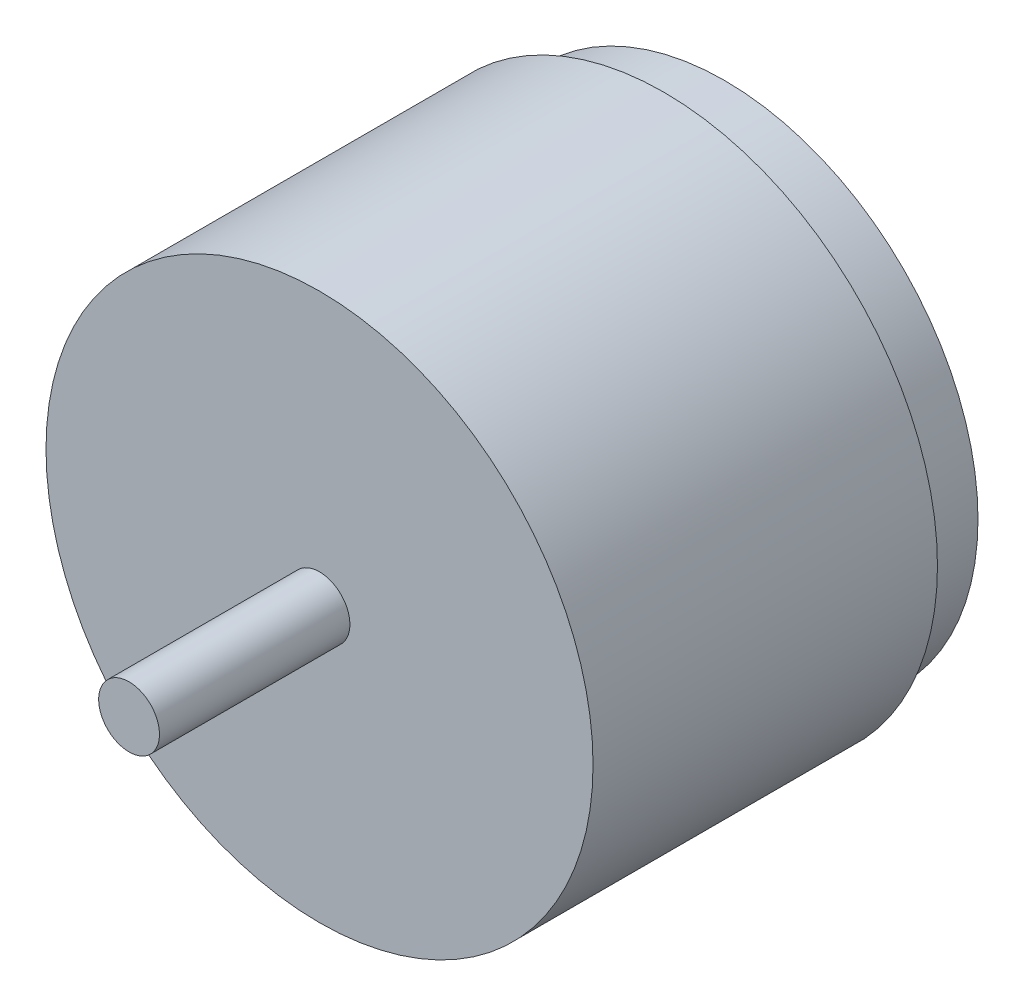
ISO-10303-21;
HEADER;
FILE_DESCRIPTION(('STEP AP214'),'2;1');
FILE_NAME('part.step','',(''),(''),'','','');
FILE_SCHEMA(('AUTOMOTIVE_DESIGN { 1 0 10303 214 1 1 1 1 }'));
ENDSEC;
DATA;
#1=APPLICATION_CONTEXT('core data for automotive mechanical design processes');
#2=APPLICATION_PROTOCOL_DEFINITION('international standard','automotive_design',2000,#1);
#3=PRODUCT_CONTEXT('',#1,'mechanical');
#4=PRODUCT('Part','Part','',(#3));
#5=PRODUCT_RELATED_PRODUCT_CATEGORY('part','',(#4));
#6=PRODUCT_DEFINITION_FORMATION('','',#4);
#7=PRODUCT_DEFINITION_CONTEXT('part definition',#1,'design');
#8=PRODUCT_DEFINITION('design','',#6,#7);
#9=PRODUCT_DEFINITION_SHAPE('','',#8);
#10=(LENGTH_UNIT() NAMED_UNIT(*) SI_UNIT(.MILLI.,.METRE.));
#11=(NAMED_UNIT(*) PLANE_ANGLE_UNIT() SI_UNIT($,.RADIAN.));
#12=(NAMED_UNIT(*) SI_UNIT($,.STERADIAN.) SOLID_ANGLE_UNIT());
#13=UNCERTAINTY_MEASURE_WITH_UNIT(LENGTH_MEASURE(1.E-05),#10,'distance_accuracy_value','');
#14=(GEOMETRIC_REPRESENTATION_CONTEXT(3) GLOBAL_UNCERTAINTY_ASSIGNED_CONTEXT((#13)) GLOBAL_UNIT_ASSIGNED_CONTEXT((#10,
#11,#12)) REPRESENTATION_CONTEXT('',''));
#15=CARTESIAN_POINT('',(0.,0.,0.));
#16=DIRECTION('',(0.,0.,1.));
#17=DIRECTION('',(1.,0.,0.));
#18=AXIS2_PLACEMENT_3D('',#15,#16,#17);
#19=CARTESIAN_POINT('',(42.638538905549,42.638538905549,14.7));
#20=DIRECTION('',(0.,0.,1.));
#21=DIRECTION('',(1.,0.,0.));
#22=AXIS2_PLACEMENT_3D('',#19,#20,#21);
#23=PLANE('',#22);
#24=CARTESIAN_POINT('',(42.638538905549,42.638538905549,14.7));
#25=DIRECTION('',(0.,0.,1.));
#26=DIRECTION('',(1.,0.,0.));
#27=AXIS2_PLACEMENT_3D('',#24,#25,#26);
#28=CIRCLE('',#27,0.75);
#29=CARTESIAN_POINT('',(43.388538905549,42.638538905549,14.7));
#30=VERTEX_POINT('',#29);
#31=EDGE_CURVE('E9',#30,#30,#28,.T.);
#32=ORIENTED_EDGE('',*,*,#31,.T.);
#33=EDGE_LOOP('',(#32));
#34=FACE_BOUND('',#33,.T.);
#35=ADVANCED_FACE('F15',(#34),#23,.T.);
#36=CARTESIAN_POINT('',(42.638538905549,42.638538905549,0.));
#37=DIRECTION('',(0.,0.,1.));
#38=DIRECTION('',(1.,0.,0.));
#39=AXIS2_PLACEMENT_3D('',#36,#37,#38);
#40=PLANE('',#39);
#41=CARTESIAN_POINT('',(42.638538905549,42.638538905549,0.));
#42=DIRECTION('',(0.,0.,1.));
#43=DIRECTION('',(1.,0.,0.));
#44=AXIS2_PLACEMENT_3D('',#41,#42,#43);
#45=CIRCLE('',#44,6.25);
#46=CARTESIAN_POINT('',(48.888538905549,42.638538905549,0.));
#47=VERTEX_POINT('',#46);
#48=EDGE_CURVE('E81',#47,#47,#45,.T.);
#49=ORIENTED_EDGE('',*,*,#48,.F.);
#50=EDGE_LOOP('',(#49));
#51=FACE_BOUND('',#50,.T.);
#52=ADVANCED_FACE('F110',(#51),#40,.F.);
#53=CARTESIAN_POINT('',(42.638538905549,42.638538905549,10.));
#54=DIRECTION('',(0.,0.,-1.));
#55=DIRECTION('',(1.,0.,0.));
#56=AXIS2_PLACEMENT_3D('',#53,#54,#55);
#57=CYLINDRICAL_SURFACE('',#56,0.75);
#58=CARTESIAN_POINT('',(42.638538905549,42.638538905549,10.));
#59=DIRECTION('',(0.,0.,1.));
#60=DIRECTION('',(1.,0.,0.));
#61=AXIS2_PLACEMENT_3D('',#58,#59,#60);
#62=CIRCLE('',#61,0.75);
#63=CARTESIAN_POINT('',(43.388538905549,42.638538905549,10.));
#64=VERTEX_POINT('',#63);
#65=EDGE_CURVE('E82',#64,#64,#62,.T.);
#66=ORIENTED_EDGE('',*,*,#65,.T.);
#67=DIRECTION('',(0.,0.,1.));
#68=VECTOR('',#67,1.);
#69=CARTESIAN_POINT('',(43.388538905549,42.638538905549,10.));
#70=LINE('',#69,#68);
#71=EDGE_CURVE('E23',#64,#30,#70,.T.);
#72=ORIENTED_EDGE('',*,*,#71,.T.);
#73=ORIENTED_EDGE('',*,*,#31,.F.);
#74=ORIENTED_EDGE('',*,*,#71,.F.);
#75=EDGE_LOOP('',(#66,#72,#73,#74));
#76=FACE_BOUND('',#75,.T.);
#77=ADVANCED_FACE('F112',(#76),#57,.T.);
#78=CARTESIAN_POINT('',(42.638538905549,42.638538905549,0.));
#79=DIRECTION('',(0.,0.,-1.));
#80=DIRECTION('',(1.,0.,0.));
#81=AXIS2_PLACEMENT_3D('',#78,#79,#80);
#82=CYLINDRICAL_SURFACE('',#81,6.25);
#83=ORIENTED_EDGE('',*,*,#48,.T.);
#84=DIRECTION('',(0.,0.,1.));
#85=VECTOR('',#84,1.);
#86=CARTESIAN_POINT('',(48.888538905549,42.638538905549,0.));
#87=LINE('',#86,#85);
#88=CARTESIAN_POINT('',(48.888538905549,42.638538905549,1.5));
#89=VERTEX_POINT('',#88);
#90=EDGE_CURVE('E37',#47,#89,#87,.T.);
#91=ORIENTED_EDGE('',*,*,#90,.T.);
#92=CARTESIAN_POINT('',(42.638538905549,42.638538905549,1.5));
#93=DIRECTION('',(0.,0.,1.));
#94=DIRECTION('',(1.,0.,0.));
#95=AXIS2_PLACEMENT_3D('',#92,#93,#94);
#96=CIRCLE('',#95,6.25);
#97=EDGE_CURVE('E75',#89,#89,#96,.T.);
#98=ORIENTED_EDGE('',*,*,#97,.F.);
#99=ORIENTED_EDGE('',*,*,#90,.F.);
#100=EDGE_LOOP('',(#83,#91,#98,#99));
#101=FACE_BOUND('',#100,.T.);
#102=ADVANCED_FACE('F89',(#101),#82,.T.);
#103=CARTESIAN_POINT('',(42.638538905549,42.638538905549,10.));
#104=DIRECTION('',(0.,0.,1.));
#105=DIRECTION('',(1.,0.,0.));
#106=AXIS2_PLACEMENT_3D('',#103,#104,#105);
#107=PLANE('',#106);
#108=ORIENTED_EDGE('',*,*,#65,.F.);
#109=EDGE_LOOP('',(#108));
#110=FACE_BOUND('',#109,.T.);
#111=CARTESIAN_POINT('',(42.638538905549,42.638538905549,10.));
#112=DIRECTION('',(0.,0.,1.));
#113=DIRECTION('',(1.,0.,0.));
#114=AXIS2_PLACEMENT_3D('',#111,#112,#113);
#115=CIRCLE('',#114,6.75);
#116=CARTESIAN_POINT('',(49.388538905549,42.638538905549,10.));
#117=VERTEX_POINT('',#116);
#118=EDGE_CURVE('E63',#117,#117,#115,.T.);
#119=ORIENTED_EDGE('',*,*,#118,.T.);
#120=EDGE_LOOP('',(#119));
#121=FACE_BOUND('',#120,.T.);
#122=ADVANCED_FACE('F92',(#110,#121),#107,.T.);
#123=CARTESIAN_POINT('',(42.638538905549,42.638538905549,1.5));
#124=DIRECTION('',(0.,0.,1.));
#125=DIRECTION('',(1.,0.,0.));
#126=AXIS2_PLACEMENT_3D('',#123,#124,#125);
#127=PLANE('',#126);
#128=ORIENTED_EDGE('',*,*,#97,.T.);
#129=EDGE_LOOP('',(#128));
#130=FACE_BOUND('',#129,.T.);
#131=CARTESIAN_POINT('',(42.638538905549,42.638538905549,1.5));
#132=DIRECTION('',(0.,0.,1.));
#133=DIRECTION('',(1.,0.,0.));
#134=AXIS2_PLACEMENT_3D('',#131,#132,#133);
#135=CIRCLE('',#134,6.75);
#136=CARTESIAN_POINT('',(49.388538905549,42.638538905549,1.5));
#137=VERTEX_POINT('',#136);
#138=EDGE_CURVE('E64',#137,#137,#135,.T.);
#139=ORIENTED_EDGE('',*,*,#138,.F.);
#140=EDGE_LOOP('',(#139));
#141=FACE_BOUND('',#140,.T.);
#142=ADVANCED_FACE('F95',(#130,#141),#127,.F.);
#143=CARTESIAN_POINT('',(42.638538905549,42.638538905549,1.5));
#144=DIRECTION('',(0.,0.,-1.));
#145=DIRECTION('',(1.,0.,0.));
#146=AXIS2_PLACEMENT_3D('',#143,#144,#145);
#147=CYLINDRICAL_SURFACE('',#146,6.75);
#148=ORIENTED_EDGE('',*,*,#138,.T.);
#149=DIRECTION('',(0.,0.,1.));
#150=VECTOR('',#149,1.);
#151=CARTESIAN_POINT('',(49.388538905549,42.638538905549,1.5));
#152=LINE('',#151,#150);
#153=EDGE_CURVE('E58',#137,#117,#152,.T.);
#154=ORIENTED_EDGE('',*,*,#153,.T.);
#155=ORIENTED_EDGE('',*,*,#118,.F.);
#156=ORIENTED_EDGE('',*,*,#153,.F.);
#157=EDGE_LOOP('',(#148,#154,#155,#156));
#158=FACE_BOUND('',#157,.T.);
#159=ADVANCED_FACE('F61',(#158),#147,.T.);
#160=CLOSED_SHELL('',(#35,#52,#77,#102,#122,#142,#159));
#161=MANIFOLD_SOLID_BREP('B1',#160);
#162=ADVANCED_BREP_SHAPE_REPRESENTATION('',(#18,#161),#14);
#163=SHAPE_DEFINITION_REPRESENTATION(#9,#162);
ENDSEC;
END-ISO-10303-21;
